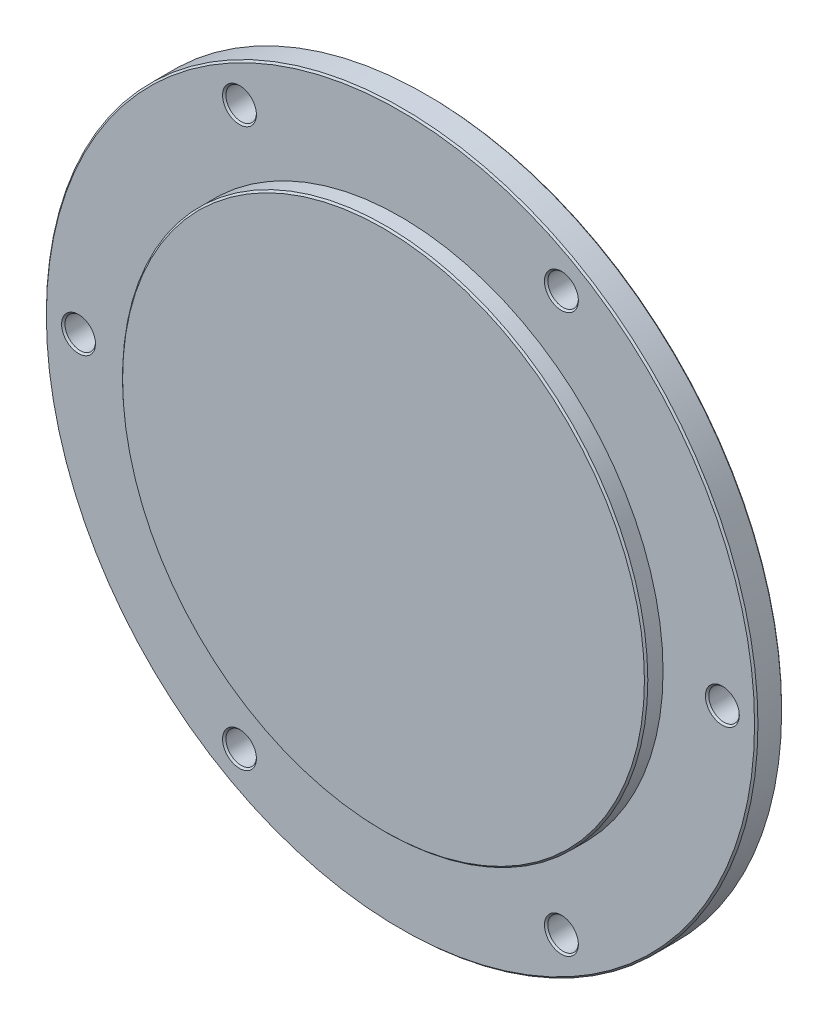
ISO-10303-21;
HEADER;
FILE_DESCRIPTION(('STEP AP214'),'2;1');
FILE_NAME('part.step','',(''),(''),'','','');
FILE_SCHEMA(('AUTOMOTIVE_DESIGN { 1 0 10303 214 1 1 1 1 }'));
ENDSEC;
DATA;
#1=APPLICATION_CONTEXT('core data for automotive mechanical design processes');
#2=APPLICATION_PROTOCOL_DEFINITION('international standard','automotive_design',2000,#1);
#3=PRODUCT_CONTEXT('',#1,'mechanical');
#4=PRODUCT('Part','Part','',(#3));
#5=PRODUCT_RELATED_PRODUCT_CATEGORY('part','',(#4));
#6=PRODUCT_DEFINITION_FORMATION('','',#4);
#7=PRODUCT_DEFINITION_CONTEXT('part definition',#1,'design');
#8=PRODUCT_DEFINITION('design','',#6,#7);
#9=PRODUCT_DEFINITION_SHAPE('','',#8);
#10=(LENGTH_UNIT() NAMED_UNIT(*) SI_UNIT(.MILLI.,.METRE.));
#11=(NAMED_UNIT(*) PLANE_ANGLE_UNIT() SI_UNIT($,.RADIAN.));
#12=(NAMED_UNIT(*) SI_UNIT($,.STERADIAN.) SOLID_ANGLE_UNIT());
#13=UNCERTAINTY_MEASURE_WITH_UNIT(LENGTH_MEASURE(1.E-05),#10,'distance_accuracy_value','');
#14=(GEOMETRIC_REPRESENTATION_CONTEXT(3) GLOBAL_UNCERTAINTY_ASSIGNED_CONTEXT((#13)) GLOBAL_UNIT_ASSIGNED_CONTEXT((#10,
#11,#12)) REPRESENTATION_CONTEXT('',''));
#15=CARTESIAN_POINT('',(0.,0.,0.));
#16=DIRECTION('',(0.,0.,1.));
#17=DIRECTION('',(1.,0.,0.));
#18=AXIS2_PLACEMENT_3D('',#15,#16,#17);
#19=CARTESIAN_POINT('',(0.,0.,0.));
#20=DIRECTION('',(0.,0.,1.));
#21=DIRECTION('',(1.,0.,0.));
#22=AXIS2_PLACEMENT_3D('',#19,#20,#21);
#23=CYLINDRICAL_SURFACE('',#22,105.);
#24=CARTESIAN_POINT('',(0.,0.,0.499999999999959));
#25=DIRECTION('',(0.,0.,-1.));
#26=DIRECTION('',(-1.,0.,0.));
#27=AXIS2_PLACEMENT_3D('',#24,#25,#26);
#28=CIRCLE('',#27,105.);
#29=CARTESIAN_POINT('',(-105.,0.,0.499999999999959));
#30=VERTEX_POINT('',#29);
#31=EDGE_CURVE('E10',#30,#30,#28,.F.);
#32=ORIENTED_EDGE('',*,*,#31,.T.);
#33=EDGE_LOOP('',(#32));
#34=FACE_BOUND('',#33,.T.);
#35=CARTESIAN_POINT('',(0.,0.,7.50000000000001));
#36=DIRECTION('',(0.,0.,1.));
#37=DIRECTION('',(1.,0.,0.));
#38=AXIS2_PLACEMENT_3D('',#35,#36,#37);
#39=CIRCLE('',#38,105.);
#40=CARTESIAN_POINT('',(105.,0.,7.50000000000001));
#41=VERTEX_POINT('',#40);
#42=EDGE_CURVE('E172',#41,#41,#39,.T.);
#43=ORIENTED_EDGE('',*,*,#42,.F.);
#44=EDGE_LOOP('',(#43));
#45=FACE_BOUND('',#44,.T.);
#46=ADVANCED_FACE('F45',(#34,#45),#23,.T.);
#47=CARTESIAN_POINT('',(105.,0.,0.));
#48=DIRECTION('',(0.,0.,-1.));
#49=DIRECTION('',(-1.,0.,0.));
#50=AXIS2_PLACEMENT_3D('',#47,#48,#49);
#51=PLANE('',#50);
#52=CARTESIAN_POINT('',(-47.5,-82.2724133595216,0.));
#53=DIRECTION('',(0.,0.,-1.));
#54=DIRECTION('',(-1.,0.,0.));
#55=AXIS2_PLACEMENT_3D('',#52,#53,#54);
#56=CIRCLE('',#55,5.00000000000009);
#57=CARTESIAN_POINT('',(-52.5000000000001,-82.2724133595216,0.));
#58=VERTEX_POINT('',#57);
#59=EDGE_CURVE('E84',#58,#58,#56,.F.);
#60=ORIENTED_EDGE('',*,*,#59,.T.);
#61=EDGE_LOOP('',(#60));
#62=FACE_BOUND('',#61,.T.);
#63=CARTESIAN_POINT('',(47.5,-82.2724133595217,0.));
#64=DIRECTION('',(0.,0.,-1.));
#65=DIRECTION('',(-1.,0.,0.));
#66=AXIS2_PLACEMENT_3D('',#63,#64,#65);
#67=CIRCLE('',#66,5.);
#68=CARTESIAN_POINT('',(42.5,-82.2724133595217,0.));
#69=VERTEX_POINT('',#68);
#70=EDGE_CURVE('E88',#69,#69,#67,.F.);
#71=ORIENTED_EDGE('',*,*,#70,.T.);
#72=EDGE_LOOP('',(#71));
#73=FACE_BOUND('',#72,.T.);
#74=CARTESIAN_POINT('',(-95.,0.,0.));
#75=DIRECTION('',(0.,0.,-1.));
#76=DIRECTION('',(-1.,0.,0.));
#77=AXIS2_PLACEMENT_3D('',#74,#75,#76);
#78=CIRCLE('',#77,5.);
#79=CARTESIAN_POINT('',(-100.,0.,0.));
#80=VERTEX_POINT('',#79);
#81=EDGE_CURVE('E92',#80,#80,#78,.F.);
#82=ORIENTED_EDGE('',*,*,#81,.T.);
#83=EDGE_LOOP('',(#82));
#84=FACE_BOUND('',#83,.T.);
#85=CARTESIAN_POINT('',(-47.5,82.2724133595217,0.));
#86=DIRECTION('',(0.,0.,-1.));
#87=DIRECTION('',(-1.,0.,0.));
#88=AXIS2_PLACEMENT_3D('',#85,#86,#87);
#89=CIRCLE('',#88,5.00000000000009);
#90=CARTESIAN_POINT('',(-52.5000000000001,82.2724133595217,0.));
#91=VERTEX_POINT('',#90);
#92=EDGE_CURVE('E96',#91,#91,#89,.F.);
#93=ORIENTED_EDGE('',*,*,#92,.T.);
#94=EDGE_LOOP('',(#93));
#95=FACE_BOUND('',#94,.T.);
#96=CARTESIAN_POINT('',(47.5,82.2724133595217,0.));
#97=DIRECTION('',(0.,0.,-1.));
#98=DIRECTION('',(-1.,0.,0.));
#99=AXIS2_PLACEMENT_3D('',#96,#97,#98);
#100=CIRCLE('',#99,5.);
#101=CARTESIAN_POINT('',(42.5,82.2724133595217,0.));
#102=VERTEX_POINT('',#101);
#103=EDGE_CURVE('E100',#102,#102,#100,.F.);
#104=ORIENTED_EDGE('',*,*,#103,.T.);
#105=EDGE_LOOP('',(#104));
#106=FACE_BOUND('',#105,.T.);
#107=CARTESIAN_POINT('',(0.,0.,0.));
#108=DIRECTION('',(0.,0.,-1.));
#109=DIRECTION('',(-1.,0.,0.));
#110=AXIS2_PLACEMENT_3D('',#107,#108,#109);
#111=CIRCLE('',#110,104.5);
#112=CARTESIAN_POINT('',(-104.5,0.,0.));
#113=VERTEX_POINT('',#112);
#114=EDGE_CURVE('E104',#113,#113,#111,.T.);
#115=ORIENTED_EDGE('',*,*,#114,.T.);
#116=EDGE_LOOP('',(#115));
#117=FACE_BOUND('',#116,.T.);
#118=CARTESIAN_POINT('',(95.,0.,0.));
#119=DIRECTION('',(0.,0.,-1.));
#120=DIRECTION('',(-1.,0.,0.));
#121=AXIS2_PLACEMENT_3D('',#118,#119,#120);
#122=CIRCLE('',#121,5.);
#123=CARTESIAN_POINT('',(90.,0.,0.));
#124=VERTEX_POINT('',#123);
#125=EDGE_CURVE('E108',#124,#124,#122,.F.);
#126=ORIENTED_EDGE('',*,*,#125,.T.);
#127=EDGE_LOOP('',(#126));
#128=FACE_BOUND('',#127,.T.);
#129=ADVANCED_FACE('F188',(#62,#73,#84,#95,#106,#117,#128),#51,.T.);
#130=CARTESIAN_POINT('',(0.,0.,8.));
#131=DIRECTION('',(0.,0.,1.));
#132=DIRECTION('',(1.,0.,0.));
#133=AXIS2_PLACEMENT_3D('',#130,#131,#132);
#134=PLANE('',#133);
#135=CARTESIAN_POINT('',(47.5,-82.2724133595217,8.));
#136=DIRECTION('',(0.,0.,1.));
#137=DIRECTION('',(1.,0.,0.));
#138=AXIS2_PLACEMENT_3D('',#135,#136,#137);
#139=CIRCLE('',#138,5.00000000000009);
#140=CARTESIAN_POINT('',(52.5000000000001,-82.2724133595217,8.));
#141=VERTEX_POINT('',#140);
#142=EDGE_CURVE('E136',#141,#141,#139,.F.);
#143=ORIENTED_EDGE('',*,*,#142,.T.);
#144=EDGE_LOOP('',(#143));
#145=FACE_BOUND('',#144,.T.);
#146=CARTESIAN_POINT('',(95.,0.,8.));
#147=DIRECTION('',(0.,0.,1.));
#148=DIRECTION('',(1.,0.,0.));
#149=AXIS2_PLACEMENT_3D('',#146,#147,#148);
#150=CIRCLE('',#149,5.00000000000009);
#151=CARTESIAN_POINT('',(100.,0.,8.));
#152=VERTEX_POINT('',#151);
#153=EDGE_CURVE('E140',#152,#152,#150,.F.);
#154=ORIENTED_EDGE('',*,*,#153,.T.);
#155=EDGE_LOOP('',(#154));
#156=FACE_BOUND('',#155,.T.);
#157=CARTESIAN_POINT('',(-95.,0.,8.));
#158=DIRECTION('',(0.,0.,1.));
#159=DIRECTION('',(1.,0.,0.));
#160=AXIS2_PLACEMENT_3D('',#157,#158,#159);
#161=CIRCLE('',#160,5.00000000000009);
#162=CARTESIAN_POINT('',(-89.9999999999999,0.,8.));
#163=VERTEX_POINT('',#162);
#164=EDGE_CURVE('E144',#163,#163,#161,.F.);
#165=ORIENTED_EDGE('',*,*,#164,.T.);
#166=EDGE_LOOP('',(#165));
#167=FACE_BOUND('',#166,.T.);
#168=CARTESIAN_POINT('',(-47.5,-82.2724133595216,8.));
#169=DIRECTION('',(0.,0.,1.));
#170=DIRECTION('',(1.,0.,0.));
#171=AXIS2_PLACEMENT_3D('',#168,#169,#170);
#172=CIRCLE('',#171,5.);
#173=CARTESIAN_POINT('',(-42.5,-82.2724133595216,8.));
#174=VERTEX_POINT('',#173);
#175=EDGE_CURVE('E148',#174,#174,#172,.F.);
#176=ORIENTED_EDGE('',*,*,#175,.T.);
#177=EDGE_LOOP('',(#176));
#178=FACE_BOUND('',#177,.T.);
#179=CARTESIAN_POINT('',(47.5,82.2724133595217,8.));
#180=DIRECTION('',(0.,0.,1.));
#181=DIRECTION('',(1.,0.,0.));
#182=AXIS2_PLACEMENT_3D('',#179,#180,#181);
#183=CIRCLE('',#182,5.00000000000009);
#184=CARTESIAN_POINT('',(52.5000000000001,82.2724133595217,8.));
#185=VERTEX_POINT('',#184);
#186=EDGE_CURVE('E152',#185,#185,#183,.F.);
#187=ORIENTED_EDGE('',*,*,#186,.T.);
#188=EDGE_LOOP('',(#187));
#189=FACE_BOUND('',#188,.T.);
#190=CARTESIAN_POINT('',(-47.5,82.2724133595217,8.));
#191=DIRECTION('',(0.,0.,1.));
#192=DIRECTION('',(1.,0.,0.));
#193=AXIS2_PLACEMENT_3D('',#190,#191,#192);
#194=CIRCLE('',#193,5.);
#195=CARTESIAN_POINT('',(-42.5,82.2724133595217,8.));
#196=VERTEX_POINT('',#195);
#197=EDGE_CURVE('E156',#196,#196,#194,.F.);
#198=ORIENTED_EDGE('',*,*,#197,.T.);
#199=EDGE_LOOP('',(#198));
#200=FACE_BOUND('',#199,.T.);
#201=CARTESIAN_POINT('',(0.,0.,8.));
#202=DIRECTION('',(0.,0.,1.));
#203=DIRECTION('',(1.,0.,0.));
#204=AXIS2_PLACEMENT_3D('',#201,#202,#203);
#205=CIRCLE('',#204,77.5);
#206=CARTESIAN_POINT('',(77.5,0.,8.));
#207=VERTEX_POINT('',#206);
#208=EDGE_CURVE('E176',#207,#207,#205,.T.);
#209=ORIENTED_EDGE('',*,*,#208,.F.);
#210=EDGE_LOOP('',(#209));
#211=FACE_BOUND('',#210,.T.);
#212=CARTESIAN_POINT('',(0.,0.,8.));
#213=DIRECTION('',(0.,0.,1.));
#214=DIRECTION('',(1.,0.,0.));
#215=AXIS2_PLACEMENT_3D('',#212,#213,#214);
#216=CIRCLE('',#215,104.5);
#217=CARTESIAN_POINT('',(104.5,0.,8.));
#218=VERTEX_POINT('',#217);
#219=EDGE_CURVE('E168',#218,#218,#216,.T.);
#220=ORIENTED_EDGE('',*,*,#219,.T.);
#221=EDGE_LOOP('',(#220));
#222=FACE_BOUND('',#221,.T.);
#223=ADVANCED_FACE('F184',(#145,#156,#167,#178,#189,#200,#211,#222),#134,.T.);
#224=CARTESIAN_POINT('',(0.,0.,8.));
#225=DIRECTION('',(0.,0.,-1.));
#226=DIRECTION('',(-1.,0.,0.));
#227=AXIS2_PLACEMENT_3D('',#224,#225,#226);
#228=CONICAL_SURFACE('',#227,104.5,0.785398163397289);
#229=ORIENTED_EDGE('',*,*,#42,.T.);
#230=EDGE_LOOP('',(#229));
#231=FACE_BOUND('',#230,.T.);
#232=ORIENTED_EDGE('',*,*,#219,.F.);
#233=EDGE_LOOP('',(#232));
#234=FACE_BOUND('',#233,.T.);
#235=ADVANCED_FACE('F187',(#231,#234),#228,.T.);
#236=CARTESIAN_POINT('',(-47.5,82.2724133595217,8.));
#237=DIRECTION('',(0.,0.,1.));
#238=DIRECTION('',(1.,0.,0.));
#239=AXIS2_PLACEMENT_3D('',#236,#237,#238);
#240=CYLINDRICAL_SURFACE('',#239,4.50000000000001);
#241=CARTESIAN_POINT('',(-47.5,82.2724133595217,0.500000000000079));
#242=DIRECTION('',(0.,0.,-1.));
#243=DIRECTION('',(-1.,0.,0.));
#244=AXIS2_PLACEMENT_3D('',#241,#242,#243);
#245=CIRCLE('',#244,4.50000000000001);
#246=CARTESIAN_POINT('',(-52.,82.2724133595217,0.500000000000079));
#247=VERTEX_POINT('',#246);
#248=EDGE_CURVE('E66',#247,#247,#245,.T.);
#249=ORIENTED_EDGE('',*,*,#248,.T.);
#250=EDGE_LOOP('',(#249));
#251=FACE_BOUND('',#250,.T.);
#252=CARTESIAN_POINT('',(-47.5,82.2724133595217,7.49999999999998));
#253=DIRECTION('',(0.,0.,1.));
#254=DIRECTION('',(1.,0.,0.));
#255=AXIS2_PLACEMENT_3D('',#252,#253,#254);
#256=CIRCLE('',#255,4.50000000000001);
#257=CARTESIAN_POINT('',(-43.,82.2724133595217,7.49999999999998));
#258=VERTEX_POINT('',#257);
#259=EDGE_CURVE('E72',#258,#258,#256,.T.);
#260=ORIENTED_EDGE('',*,*,#259,.T.);
#261=EDGE_LOOP('',(#260));
#262=FACE_BOUND('',#261,.T.);
#263=ADVANCED_FACE('F194',(#251,#262),#240,.F.);
#264=CARTESIAN_POINT('',(-47.5,-82.2724133595216,8.));
#265=DIRECTION('',(0.,0.,1.));
#266=DIRECTION('',(1.,0.,0.));
#267=AXIS2_PLACEMENT_3D('',#264,#265,#266);
#268=CYLINDRICAL_SURFACE('',#267,4.50000000000001);
#269=CARTESIAN_POINT('',(-47.5,-82.2724133595216,0.500000000000079));
#270=DIRECTION('',(0.,0.,-1.));
#271=DIRECTION('',(-1.,0.,0.));
#272=AXIS2_PLACEMENT_3D('',#269,#270,#271);
#273=CIRCLE('',#272,4.50000000000001);
#274=CARTESIAN_POINT('',(-52.,-82.2724133595216,0.500000000000079));
#275=VERTEX_POINT('',#274);
#276=EDGE_CURVE('E76',#275,#275,#273,.T.);
#277=ORIENTED_EDGE('',*,*,#276,.T.);
#278=EDGE_LOOP('',(#277));
#279=FACE_BOUND('',#278,.T.);
#280=CARTESIAN_POINT('',(-47.5,-82.2724133595216,7.49999999999998));
#281=DIRECTION('',(0.,0.,1.));
#282=DIRECTION('',(1.,0.,0.));
#283=AXIS2_PLACEMENT_3D('',#280,#281,#282);
#284=CIRCLE('',#283,4.50000000000001);
#285=CARTESIAN_POINT('',(-43.,-82.2724133595216,7.49999999999998));
#286=VERTEX_POINT('',#285);
#287=EDGE_CURVE('E80',#286,#286,#284,.T.);
#288=ORIENTED_EDGE('',*,*,#287,.T.);
#289=EDGE_LOOP('',(#288));
#290=FACE_BOUND('',#289,.T.);
#291=ADVANCED_FACE('F201',(#279,#290),#268,.F.);
#292=CARTESIAN_POINT('',(95.,0.,0.));
#293=DIRECTION('',(0.,0.,-1.));
#294=DIRECTION('',(-1.,0.,0.));
#295=AXIS2_PLACEMENT_3D('',#292,#293,#294);
#296=CYLINDRICAL_SURFACE('',#295,4.5);
#297=CARTESIAN_POINT('',(95.,0.,7.49999999999991));
#298=DIRECTION('',(0.,0.,1.));
#299=DIRECTION('',(1.,0.,0.));
#300=AXIS2_PLACEMENT_3D('',#297,#298,#299);
#301=CIRCLE('',#300,4.5);
#302=CARTESIAN_POINT('',(99.5,0.,7.49999999999991));
#303=VERTEX_POINT('',#302);
#304=EDGE_CURVE('E120',#303,#303,#301,.T.);
#305=ORIENTED_EDGE('',*,*,#304,.T.);
#306=EDGE_LOOP('',(#305));
#307=FACE_BOUND('',#306,.T.);
#308=CARTESIAN_POINT('',(95.,0.,0.500000000000029));
#309=DIRECTION('',(0.,0.,-1.));
#310=DIRECTION('',(-1.,0.,0.));
#311=AXIS2_PLACEMENT_3D('',#308,#309,#310);
#312=CIRCLE('',#311,4.5);
#313=CARTESIAN_POINT('',(90.5,0.,0.500000000000029));
#314=VERTEX_POINT('',#313);
#315=EDGE_CURVE('E124',#314,#314,#312,.T.);
#316=ORIENTED_EDGE('',*,*,#315,.T.);
#317=EDGE_LOOP('',(#316));
#318=FACE_BOUND('',#317,.T.);
#319=ADVANCED_FACE('F310',(#307,#318),#296,.F.);
#320=CARTESIAN_POINT('',(47.5,82.2724133595217,0.));
#321=DIRECTION('',(0.,0.,-1.));
#322=DIRECTION('',(-1.,0.,0.));
#323=AXIS2_PLACEMENT_3D('',#320,#321,#322);
#324=CYLINDRICAL_SURFACE('',#323,4.50000000000001);
#325=CARTESIAN_POINT('',(47.5,82.2724133595217,7.49999999999992));
#326=DIRECTION('',(0.,0.,1.));
#327=DIRECTION('',(1.,0.,0.));
#328=AXIS2_PLACEMENT_3D('',#325,#326,#327);
#329=CIRCLE('',#328,4.50000000000001);
#330=CARTESIAN_POINT('',(52.,82.2724133595217,7.49999999999992));
#331=VERTEX_POINT('',#330);
#332=EDGE_CURVE('E54',#331,#331,#329,.T.);
#333=ORIENTED_EDGE('',*,*,#332,.T.);
#334=EDGE_LOOP('',(#333));
#335=FACE_BOUND('',#334,.T.);
#336=CARTESIAN_POINT('',(47.5,82.2724133595217,0.500000000000022));
#337=DIRECTION('',(0.,0.,-1.));
#338=DIRECTION('',(-1.,0.,0.));
#339=AXIS2_PLACEMENT_3D('',#336,#337,#338);
#340=CIRCLE('',#339,4.50000000000001);
#341=CARTESIAN_POINT('',(43.,82.2724133595217,0.500000000000022));
#342=VERTEX_POINT('',#341);
#343=EDGE_CURVE('E60',#342,#342,#340,.T.);
#344=ORIENTED_EDGE('',*,*,#343,.T.);
#345=EDGE_LOOP('',(#344));
#346=FACE_BOUND('',#345,.T.);
#347=ADVANCED_FACE('F312',(#335,#346),#324,.F.);
#348=CARTESIAN_POINT('',(-95.,0.,0.));
#349=DIRECTION('',(0.,0.,-1.));
#350=DIRECTION('',(-1.,0.,0.));
#351=AXIS2_PLACEMENT_3D('',#348,#349,#350);
#352=CYLINDRICAL_SURFACE('',#351,4.5);
#353=CARTESIAN_POINT('',(-95.,0.,7.49999999999991));
#354=DIRECTION('',(0.,0.,1.));
#355=DIRECTION('',(1.,0.,0.));
#356=AXIS2_PLACEMENT_3D('',#353,#354,#355);
#357=CIRCLE('',#356,4.5);
#358=CARTESIAN_POINT('',(-90.5,0.,7.49999999999991));
#359=VERTEX_POINT('',#358);
#360=EDGE_CURVE('E112',#359,#359,#357,.T.);
#361=ORIENTED_EDGE('',*,*,#360,.T.);
#362=EDGE_LOOP('',(#361));
#363=FACE_BOUND('',#362,.T.);
#364=CARTESIAN_POINT('',(-95.,0.,0.500000000000029));
#365=DIRECTION('',(0.,0.,-1.));
#366=DIRECTION('',(-1.,0.,0.));
#367=AXIS2_PLACEMENT_3D('',#364,#365,#366);
#368=CIRCLE('',#367,4.5);
#369=CARTESIAN_POINT('',(-99.5,0.,0.500000000000029));
#370=VERTEX_POINT('',#369);
#371=EDGE_CURVE('E116',#370,#370,#368,.T.);
#372=ORIENTED_EDGE('',*,*,#371,.T.);
#373=EDGE_LOOP('',(#372));
#374=FACE_BOUND('',#373,.T.);
#375=ADVANCED_FACE('F319',(#363,#374),#352,.F.);
#376=CARTESIAN_POINT('',(47.5,-82.2724133595217,0.));
#377=DIRECTION('',(0.,0.,-1.));
#378=DIRECTION('',(-1.,0.,0.));
#379=AXIS2_PLACEMENT_3D('',#376,#377,#378);
#380=CYLINDRICAL_SURFACE('',#379,4.50000000000001);
#381=CARTESIAN_POINT('',(47.5,-82.2724133595217,7.49999999999992));
#382=DIRECTION('',(0.,0.,1.));
#383=DIRECTION('',(1.,0.,0.));
#384=AXIS2_PLACEMENT_3D('',#381,#382,#383);
#385=CIRCLE('',#384,4.50000000000001);
#386=CARTESIAN_POINT('',(52.,-82.2724133595217,7.49999999999992));
#387=VERTEX_POINT('',#386);
#388=EDGE_CURVE('E128',#387,#387,#385,.T.);
#389=ORIENTED_EDGE('',*,*,#388,.T.);
#390=EDGE_LOOP('',(#389));
#391=FACE_BOUND('',#390,.T.);
#392=CARTESIAN_POINT('',(47.5,-82.2724133595217,0.500000000000022));
#393=DIRECTION('',(0.,0.,-1.));
#394=DIRECTION('',(-1.,0.,0.));
#395=AXIS2_PLACEMENT_3D('',#392,#393,#394);
#396=CIRCLE('',#395,4.50000000000001);
#397=CARTESIAN_POINT('',(43.,-82.2724133595217,0.500000000000022));
#398=VERTEX_POINT('',#397);
#399=EDGE_CURVE('E132',#398,#398,#396,.T.);
#400=ORIENTED_EDGE('',*,*,#399,.T.);
#401=EDGE_LOOP('',(#400));
#402=FACE_BOUND('',#401,.T.);
#403=ADVANCED_FACE('F326',(#391,#402),#380,.F.);
#404=CARTESIAN_POINT('',(0.,0.,13.));
#405=DIRECTION('',(0.,0.,-1.));
#406=DIRECTION('',(-1.,0.,0.));
#407=AXIS2_PLACEMENT_3D('',#404,#405,#406);
#408=CYLINDRICAL_SURFACE('',#407,77.5);
#409=CARTESIAN_POINT('',(0.,0.,12.5));
#410=DIRECTION('',(0.,0.,1.));
#411=DIRECTION('',(1.,0.,0.));
#412=AXIS2_PLACEMENT_3D('',#409,#410,#411);
#413=CIRCLE('',#412,77.5);
#414=CARTESIAN_POINT('',(77.5,0.,12.5));
#415=VERTEX_POINT('',#414);
#416=EDGE_CURVE('E160',#415,#415,#413,.F.);
#417=ORIENTED_EDGE('',*,*,#416,.T.);
#418=EDGE_LOOP('',(#417));
#419=FACE_BOUND('',#418,.T.);
#420=ORIENTED_EDGE('',*,*,#208,.T.);
#421=EDGE_LOOP('',(#420));
#422=FACE_BOUND('',#421,.T.);
#423=ADVANCED_FACE('F182',(#419,#422),#408,.T.);
#424=CARTESIAN_POINT('',(0.,0.,13.));
#425=DIRECTION('',(0.,0.,1.));
#426=DIRECTION('',(1.,0.,0.));
#427=AXIS2_PLACEMENT_3D('',#424,#425,#426);
#428=PLANE('',#427);
#429=CARTESIAN_POINT('',(0.,0.,13.));
#430=DIRECTION('',(0.,0.,1.));
#431=DIRECTION('',(1.,0.,0.));
#432=AXIS2_PLACEMENT_3D('',#429,#430,#431);
#433=CIRCLE('',#432,77.);
#434=CARTESIAN_POINT('',(77.,0.,13.));
#435=VERTEX_POINT('',#434);
#436=EDGE_CURVE('E164',#435,#435,#433,.T.);
#437=ORIENTED_EDGE('',*,*,#436,.T.);
#438=EDGE_LOOP('',(#437));
#439=FACE_BOUND('',#438,.T.);
#440=ADVANCED_FACE('F220',(#439),#428,.T.);
#441=CARTESIAN_POINT('',(0.,0.,13.));
#442=DIRECTION('',(0.,0.,-1.));
#443=DIRECTION('',(-1.,0.,0.));
#444=AXIS2_PLACEMENT_3D('',#441,#442,#443);
#445=CONICAL_SURFACE('',#444,77.,0.785398163397476);
#446=ORIENTED_EDGE('',*,*,#416,.F.);
#447=EDGE_LOOP('',(#446));
#448=FACE_BOUND('',#447,.T.);
#449=ORIENTED_EDGE('',*,*,#436,.F.);
#450=EDGE_LOOP('',(#449));
#451=FACE_BOUND('',#450,.T.);
#452=ADVANCED_FACE('F213',(#448,#451),#445,.T.);
#453=CARTESIAN_POINT('',(47.5,-82.2724133595217,8.));
#454=DIRECTION('',(0.,0.,1.));
#455=DIRECTION('',(1.,0.,0.));
#456=AXIS2_PLACEMENT_3D('',#453,#454,#455);
#457=CONICAL_SURFACE('',#456,5.00000000000009,0.785398163397446);
#458=ORIENTED_EDGE('',*,*,#388,.F.);
#459=EDGE_LOOP('',(#458));
#460=FACE_BOUND('',#459,.T.);
#461=ORIENTED_EDGE('',*,*,#142,.F.);
#462=EDGE_LOOP('',(#461));
#463=FACE_BOUND('',#462,.T.);
#464=ADVANCED_FACE('F219',(#460,#463),#457,.F.);
#465=CARTESIAN_POINT('',(95.,0.,8.));
#466=DIRECTION('',(0.,0.,1.));
#467=DIRECTION('',(1.,0.,0.));
#468=AXIS2_PLACEMENT_3D('',#465,#466,#467);
#469=CONICAL_SURFACE('',#468,5.00000000000009,0.785398163397446);
#470=ORIENTED_EDGE('',*,*,#304,.F.);
#471=EDGE_LOOP('',(#470));
#472=FACE_BOUND('',#471,.T.);
#473=ORIENTED_EDGE('',*,*,#153,.F.);
#474=EDGE_LOOP('',(#473));
#475=FACE_BOUND('',#474,.T.);
#476=ADVANCED_FACE('F227',(#472,#475),#469,.F.);
#477=CARTESIAN_POINT('',(-95.,0.,8.));
#478=DIRECTION('',(0.,0.,1.));
#479=DIRECTION('',(1.,0.,0.));
#480=AXIS2_PLACEMENT_3D('',#477,#478,#479);
#481=CONICAL_SURFACE('',#480,5.00000000000009,0.785398163397446);
#482=ORIENTED_EDGE('',*,*,#360,.F.);
#483=EDGE_LOOP('',(#482));
#484=FACE_BOUND('',#483,.T.);
#485=ORIENTED_EDGE('',*,*,#164,.F.);
#486=EDGE_LOOP('',(#485));
#487=FACE_BOUND('',#486,.T.);
#488=ADVANCED_FACE('F234',(#484,#487),#481,.F.);
#489=CARTESIAN_POINT('',(-47.5,-82.2724133595216,0.));
#490=DIRECTION('',(0.,0.,-1.));
#491=DIRECTION('',(-1.,0.,0.));
#492=AXIS2_PLACEMENT_3D('',#489,#490,#491);
#493=CONICAL_SURFACE('',#492,5.00000000000009,0.785398163397446);
#494=ORIENTED_EDGE('',*,*,#276,.F.);
#495=EDGE_LOOP('',(#494));
#496=FACE_BOUND('',#495,.T.);
#497=ORIENTED_EDGE('',*,*,#59,.F.);
#498=EDGE_LOOP('',(#497));
#499=FACE_BOUND('',#498,.T.);
#500=ADVANCED_FACE('F241',(#496,#499),#493,.F.);
#501=CARTESIAN_POINT('',(47.5,-82.2724133595217,0.500000000000022));
#502=DIRECTION('',(0.,0.,-1.));
#503=DIRECTION('',(-1.,0.,0.));
#504=AXIS2_PLACEMENT_3D('',#501,#502,#503);
#505=CONICAL_SURFACE('',#504,4.50000000000001,0.78539816339742);
#506=ORIENTED_EDGE('',*,*,#70,.F.);
#507=EDGE_LOOP('',(#506));
#508=FACE_BOUND('',#507,.T.);
#509=ORIENTED_EDGE('',*,*,#399,.F.);
#510=EDGE_LOOP('',(#509));
#511=FACE_BOUND('',#510,.T.);
#512=ADVANCED_FACE('F248',(#508,#511),#505,.F.);
#513=CARTESIAN_POINT('',(-95.,0.,0.500000000000029));
#514=DIRECTION('',(0.,0.,-1.));
#515=DIRECTION('',(-1.,0.,0.));
#516=AXIS2_PLACEMENT_3D('',#513,#514,#515);
#517=CONICAL_SURFACE('',#516,4.5,0.78539816339742);
#518=ORIENTED_EDGE('',*,*,#81,.F.);
#519=EDGE_LOOP('',(#518));
#520=FACE_BOUND('',#519,.T.);
#521=ORIENTED_EDGE('',*,*,#371,.F.);
#522=EDGE_LOOP('',(#521));
#523=FACE_BOUND('',#522,.T.);
#524=ADVANCED_FACE('F255',(#520,#523),#517,.F.);
#525=CARTESIAN_POINT('',(-47.5,-82.2724133595216,7.49999999999998));
#526=DIRECTION('',(0.,0.,1.));
#527=DIRECTION('',(1.,0.,0.));
#528=AXIS2_PLACEMENT_3D('',#525,#526,#527);
#529=CONICAL_SURFACE('',#528,4.50000000000001,0.78539816339742);
#530=ORIENTED_EDGE('',*,*,#175,.F.);
#531=EDGE_LOOP('',(#530));
#532=FACE_BOUND('',#531,.T.);
#533=ORIENTED_EDGE('',*,*,#287,.F.);
#534=EDGE_LOOP('',(#533));
#535=FACE_BOUND('',#534,.T.);
#536=ADVANCED_FACE('F262',(#532,#535),#529,.F.);
#537=CARTESIAN_POINT('',(-47.5,82.2724133595217,0.));
#538=DIRECTION('',(0.,0.,-1.));
#539=DIRECTION('',(-1.,0.,0.));
#540=AXIS2_PLACEMENT_3D('',#537,#538,#539);
#541=CONICAL_SURFACE('',#540,5.00000000000009,0.785398163397446);
#542=ORIENTED_EDGE('',*,*,#248,.F.);
#543=EDGE_LOOP('',(#542));
#544=FACE_BOUND('',#543,.T.);
#545=ORIENTED_EDGE('',*,*,#92,.F.);
#546=EDGE_LOOP('',(#545));
#547=FACE_BOUND('',#546,.T.);
#548=ADVANCED_FACE('F269',(#544,#547),#541,.F.);
#549=CARTESIAN_POINT('',(47.5,82.2724133595217,8.));
#550=DIRECTION('',(0.,0.,1.));
#551=DIRECTION('',(1.,0.,0.));
#552=AXIS2_PLACEMENT_3D('',#549,#550,#551);
#553=CONICAL_SURFACE('',#552,5.00000000000009,0.785398163397446);
#554=ORIENTED_EDGE('',*,*,#332,.F.);
#555=EDGE_LOOP('',(#554));
#556=FACE_BOUND('',#555,.T.);
#557=ORIENTED_EDGE('',*,*,#186,.F.);
#558=EDGE_LOOP('',(#557));
#559=FACE_BOUND('',#558,.T.);
#560=ADVANCED_FACE('F276',(#556,#559),#553,.F.);
#561=CARTESIAN_POINT('',(47.5,82.2724133595217,0.500000000000022));
#562=DIRECTION('',(0.,0.,-1.));
#563=DIRECTION('',(-1.,0.,0.));
#564=AXIS2_PLACEMENT_3D('',#561,#562,#563);
#565=CONICAL_SURFACE('',#564,4.50000000000001,0.78539816339742);
#566=ORIENTED_EDGE('',*,*,#103,.F.);
#567=EDGE_LOOP('',(#566));
#568=FACE_BOUND('',#567,.T.);
#569=ORIENTED_EDGE('',*,*,#343,.F.);
#570=EDGE_LOOP('',(#569));
#571=FACE_BOUND('',#570,.T.);
#572=ADVANCED_FACE('F283',(#568,#571),#565,.F.);
#573=CARTESIAN_POINT('',(0.,0.,0.499999999999959));
#574=DIRECTION('',(0.,0.,1.));
#575=DIRECTION('',(1.,0.,0.));
#576=AXIS2_PLACEMENT_3D('',#573,#574,#575);
#577=CONICAL_SURFACE('',#576,105.,0.785398163397434);
#578=ORIENTED_EDGE('',*,*,#114,.F.);
#579=EDGE_LOOP('',(#578));
#580=FACE_BOUND('',#579,.T.);
#581=ORIENTED_EDGE('',*,*,#31,.F.);
#582=EDGE_LOOP('',(#581));
#583=FACE_BOUND('',#582,.T.);
#584=ADVANCED_FACE('F290',(#580,#583),#577,.T.);
#585=CARTESIAN_POINT('',(95.,0.,0.500000000000029));
#586=DIRECTION('',(0.,0.,-1.));
#587=DIRECTION('',(-1.,0.,0.));
#588=AXIS2_PLACEMENT_3D('',#585,#586,#587);
#589=CONICAL_SURFACE('',#588,4.5,0.78539816339742);
#590=ORIENTED_EDGE('',*,*,#125,.F.);
#591=EDGE_LOOP('',(#590));
#592=FACE_BOUND('',#591,.T.);
#593=ORIENTED_EDGE('',*,*,#315,.F.);
#594=EDGE_LOOP('',(#593));
#595=FACE_BOUND('',#594,.T.);
#596=ADVANCED_FACE('F296',(#592,#595),#589,.F.);
#597=CARTESIAN_POINT('',(-47.5,82.2724133595217,7.49999999999998));
#598=DIRECTION('',(0.,0.,1.));
#599=DIRECTION('',(1.,0.,0.));
#600=AXIS2_PLACEMENT_3D('',#597,#598,#599);
#601=CONICAL_SURFACE('',#600,4.50000000000001,0.78539816339742);
#602=ORIENTED_EDGE('',*,*,#197,.F.);
#603=EDGE_LOOP('',(#602));
#604=FACE_BOUND('',#603,.T.);
#605=ORIENTED_EDGE('',*,*,#259,.F.);
#606=EDGE_LOOP('',(#605));
#607=FACE_BOUND('',#606,.T.);
#608=ADVANCED_FACE('F48',(#604,#607),#601,.F.);
#609=CLOSED_SHELL('',(#46,#129,#223,#235,#263,#291,#319,#347,#375,#403,#423,#440,#452,#464,#476,
#488,#500,#512,#524,#536,#548,#560,#572,#584,#596,#608));
#610=MANIFOLD_SOLID_BREP('B2',#609);
#611=ADVANCED_BREP_SHAPE_REPRESENTATION('',(#18,#610),#14);
#612=SHAPE_DEFINITION_REPRESENTATION(#9,#611);
ENDSEC;
END-ISO-10303-21;
